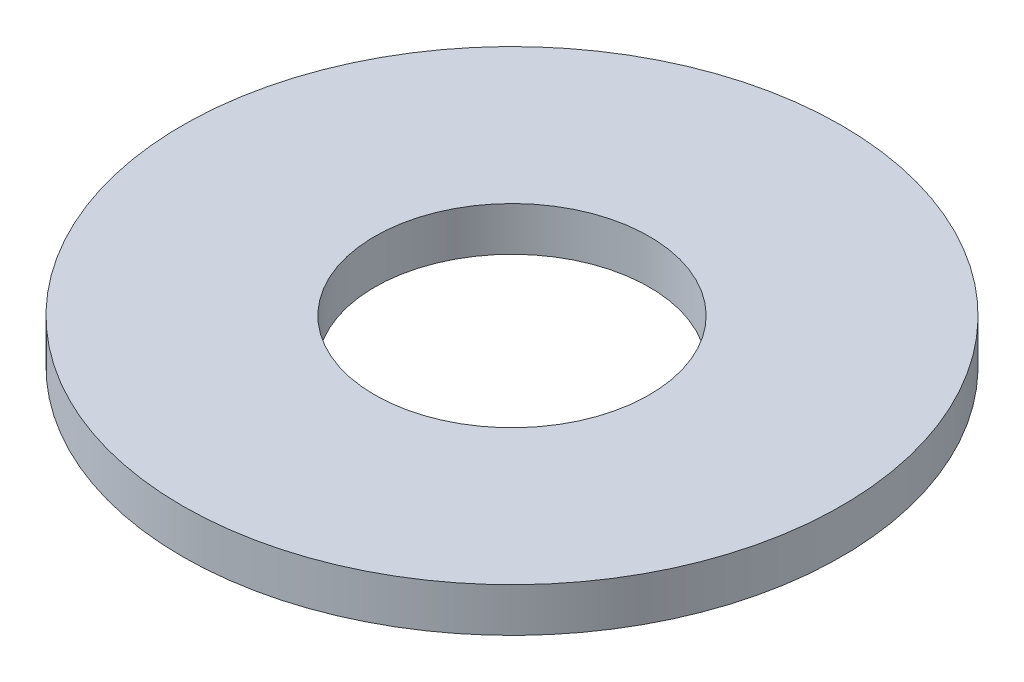
ISO-10303-21;
HEADER;
FILE_DESCRIPTION(('STEP AP214'),'2;1');
FILE_NAME('part.step','',(''),(''),'','','');
FILE_SCHEMA(('AUTOMOTIVE_DESIGN { 1 0 10303 214 1 1 1 1 }'));
ENDSEC;
DATA;
#1=APPLICATION_CONTEXT('core data for automotive mechanical design processes');
#2=APPLICATION_PROTOCOL_DEFINITION('international standard','automotive_design',2000,#1);
#3=PRODUCT_CONTEXT('',#1,'mechanical');
#4=PRODUCT('Part','Part','',(#3));
#5=PRODUCT_RELATED_PRODUCT_CATEGORY('part','',(#4));
#6=PRODUCT_DEFINITION_FORMATION('','',#4);
#7=PRODUCT_DEFINITION_CONTEXT('part definition',#1,'design');
#8=PRODUCT_DEFINITION('design','',#6,#7);
#9=PRODUCT_DEFINITION_SHAPE('','',#8);
#10=(LENGTH_UNIT() NAMED_UNIT(*) SI_UNIT(.MILLI.,.METRE.));
#11=(NAMED_UNIT(*) PLANE_ANGLE_UNIT() SI_UNIT($,.RADIAN.));
#12=(NAMED_UNIT(*) SI_UNIT($,.STERADIAN.) SOLID_ANGLE_UNIT());
#13=UNCERTAINTY_MEASURE_WITH_UNIT(LENGTH_MEASURE(1.E-05),#10,'distance_accuracy_value','');
#14=(GEOMETRIC_REPRESENTATION_CONTEXT(3) GLOBAL_UNCERTAINTY_ASSIGNED_CONTEXT((#13)) GLOBAL_UNIT_ASSIGNED_CONTEXT((#10,
#11,#12)) REPRESENTATION_CONTEXT('',''));
#15=CARTESIAN_POINT('',(0.,0.,0.));
#16=DIRECTION('',(0.,0.,1.));
#17=DIRECTION('',(1.,0.,0.));
#18=AXIS2_PLACEMENT_3D('',#15,#16,#17);
#19=CARTESIAN_POINT('',(0.,2.54,0.));
#20=DIRECTION('',(0.,1.,0.));
#21=DIRECTION('',(0.,0.,1.));
#22=AXIS2_PLACEMENT_3D('',#19,#20,#21);
#23=PLANE('',#22);
#24=CARTESIAN_POINT('',(0.,2.54,0.));
#25=DIRECTION('',(0.,1.,0.));
#26=DIRECTION('',(0.,0.,1.));
#27=AXIS2_PLACEMENT_3D('',#24,#25,#26);
#28=CIRCLE('',#27,19.05);
#29=CARTESIAN_POINT('',(0.,2.54,19.05));
#30=VERTEX_POINT('',#29);
#31=EDGE_CURVE('E12',#30,#30,#28,.T.);
#32=ORIENTED_EDGE('',*,*,#31,.T.);
#33=EDGE_LOOP('',(#32));
#34=FACE_BOUND('',#33,.T.);
#35=CARTESIAN_POINT('',(0.,2.54,0.));
#36=DIRECTION('',(0.,1.,0.));
#37=DIRECTION('',(0.,0.,1.));
#38=AXIS2_PLACEMENT_3D('',#35,#36,#37);
#39=CIRCLE('',#38,7.9375);
#40=CARTESIAN_POINT('',(0.,2.54,7.9375));
#41=VERTEX_POINT('',#40);
#42=EDGE_CURVE('E66',#41,#41,#39,.T.);
#43=ORIENTED_EDGE('',*,*,#42,.F.);
#44=EDGE_LOOP('',(#43));
#45=FACE_BOUND('',#44,.T.);
#46=ADVANCED_FACE('F53',(#34,#45),#23,.T.);
#47=CARTESIAN_POINT('',(0.,0.,0.));
#48=DIRECTION('',(0.,1.,0.));
#49=DIRECTION('',(0.,0.,1.));
#50=AXIS2_PLACEMENT_3D('',#47,#48,#49);
#51=PLANE('',#50);
#52=CARTESIAN_POINT('',(0.,0.,0.));
#53=DIRECTION('',(0.,1.,0.));
#54=DIRECTION('',(0.,0.,1.));
#55=AXIS2_PLACEMENT_3D('',#52,#53,#54);
#56=CIRCLE('',#55,19.05);
#57=CARTESIAN_POINT('',(0.,0.,19.05));
#58=VERTEX_POINT('',#57);
#59=EDGE_CURVE('E57',#58,#58,#56,.T.);
#60=ORIENTED_EDGE('',*,*,#59,.F.);
#61=EDGE_LOOP('',(#60));
#62=FACE_BOUND('',#61,.T.);
#63=CARTESIAN_POINT('',(0.,0.,0.));
#64=DIRECTION('',(0.,1.,0.));
#65=DIRECTION('',(0.,0.,1.));
#66=AXIS2_PLACEMENT_3D('',#63,#64,#65);
#67=CIRCLE('',#66,7.9375);
#68=CARTESIAN_POINT('',(0.,0.,7.9375));
#69=VERTEX_POINT('',#68);
#70=EDGE_CURVE('E68',#69,#69,#67,.T.);
#71=ORIENTED_EDGE('',*,*,#70,.T.);
#72=EDGE_LOOP('',(#71));
#73=FACE_BOUND('',#72,.T.);
#74=ADVANCED_FACE('F80',(#62,#73),#51,.F.);
#75=CARTESIAN_POINT('',(0.,2.54,0.));
#76=DIRECTION('',(0.,-1.,0.));
#77=DIRECTION('',(0.,0.,-1.));
#78=AXIS2_PLACEMENT_3D('',#75,#76,#77);
#79=CYLINDRICAL_SURFACE('',#78,19.05);
#80=ORIENTED_EDGE('',*,*,#31,.F.);
#81=EDGE_LOOP('',(#80));
#82=FACE_BOUND('',#81,.T.);
#83=ORIENTED_EDGE('',*,*,#59,.T.);
#84=EDGE_LOOP('',(#83));
#85=FACE_BOUND('',#84,.T.);
#86=ADVANCED_FACE('F55',(#82,#85),#79,.T.);
#87=CARTESIAN_POINT('',(0.,2.54,0.));
#88=DIRECTION('',(0.,-1.,0.));
#89=DIRECTION('',(0.,0.,-1.));
#90=AXIS2_PLACEMENT_3D('',#87,#88,#89);
#91=CYLINDRICAL_SURFACE('',#90,7.9375);
#92=ORIENTED_EDGE('',*,*,#42,.T.);
#93=EDGE_LOOP('',(#92));
#94=FACE_BOUND('',#93,.T.);
#95=ORIENTED_EDGE('',*,*,#70,.F.);
#96=EDGE_LOOP('',(#95));
#97=FACE_BOUND('',#96,.T.);
#98=ADVANCED_FACE('F76',(#94,#97),#91,.F.);
#99=CLOSED_SHELL('',(#46,#74,#86,#98));
#100=MANIFOLD_SOLID_BREP('B2',#99);
#101=ADVANCED_BREP_SHAPE_REPRESENTATION('',(#18,#100),#14);
#102=SHAPE_DEFINITION_REPRESENTATION(#9,#101);
ENDSEC;
END-ISO-10303-21;
